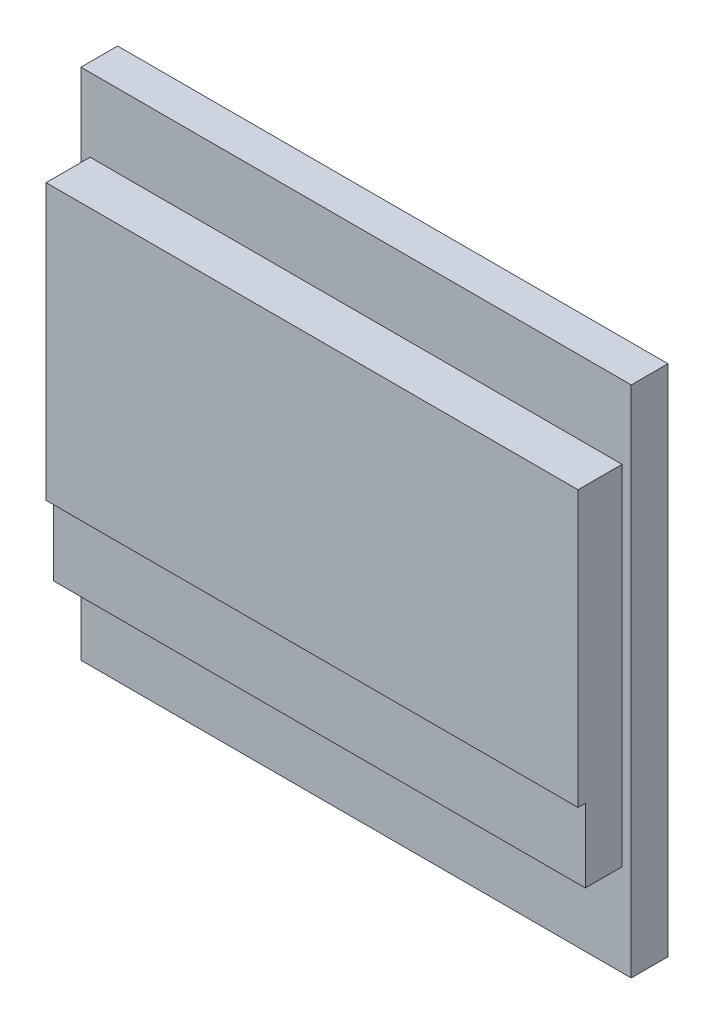
ISO-10303-21;
HEADER;
FILE_DESCRIPTION(('STEP AP214'),'2;1');
FILE_NAME('part.step','',(''),(''),'','','');
FILE_SCHEMA(('AUTOMOTIVE_DESIGN { 1 0 10303 214 1 1 1 1 }'));
ENDSEC;
DATA;
#1=APPLICATION_CONTEXT('core data for automotive mechanical design processes');
#2=APPLICATION_PROTOCOL_DEFINITION('international standard','automotive_design',2000,#1);
#3=PRODUCT_CONTEXT('',#1,'mechanical');
#4=PRODUCT('Part','Part','',(#3));
#5=PRODUCT_RELATED_PRODUCT_CATEGORY('part','',(#4));
#6=PRODUCT_DEFINITION_FORMATION('','',#4);
#7=PRODUCT_DEFINITION_CONTEXT('part definition',#1,'design');
#8=PRODUCT_DEFINITION('design','',#6,#7);
#9=PRODUCT_DEFINITION_SHAPE('','',#8);
#10=(LENGTH_UNIT() NAMED_UNIT(*) SI_UNIT(.MILLI.,.METRE.));
#11=(NAMED_UNIT(*) PLANE_ANGLE_UNIT() SI_UNIT($,.RADIAN.));
#12=(NAMED_UNIT(*) SI_UNIT($,.STERADIAN.) SOLID_ANGLE_UNIT());
#13=UNCERTAINTY_MEASURE_WITH_UNIT(LENGTH_MEASURE(1.E-05),#10,'distance_accuracy_value','');
#14=(GEOMETRIC_REPRESENTATION_CONTEXT(3) GLOBAL_UNCERTAINTY_ASSIGNED_CONTEXT((#13)) GLOBAL_UNIT_ASSIGNED_CONTEXT((#10,
#11,#12)) REPRESENTATION_CONTEXT('',''));
#15=CARTESIAN_POINT('',(0.,0.,0.));
#16=DIRECTION('',(0.,0.,1.));
#17=DIRECTION('',(1.,0.,0.));
#18=AXIS2_PLACEMENT_3D('',#15,#16,#17);
#19=CARTESIAN_POINT('',(0.,0.,2.));
#20=DIRECTION('',(0.,0.,1.));
#21=DIRECTION('',(1.,0.,0.));
#22=AXIS2_PLACEMENT_3D('',#19,#20,#21);
#23=PLANE('',#22);
#24=DIRECTION('',(0.,1.,0.));
#25=VECTOR('',#24,1.);
#26=CARTESIAN_POINT('',(14.5,-8.99999999999999,2.));
#27=LINE('',#26,#25);
#28=CARTESIAN_POINT('',(14.5,-8.99999999999999,2.));
#29=VERTEX_POINT('',#28);
#30=CARTESIAN_POINT('',(14.5,-4.99999999999999,2.));
#31=VERTEX_POINT('',#30);
#32=EDGE_CURVE('E157',#29,#31,#27,.T.);
#33=ORIENTED_EDGE('',*,*,#32,.T.);
#34=DIRECTION('',(-1.,0.,0.));
#35=VECTOR('',#34,1.);
#36=CARTESIAN_POINT('',(0.,-4.99999999999999,2.));
#37=LINE('',#36,#35);
#38=CARTESIAN_POINT('',(-14.5,-4.99999999999999,2.));
#39=VERTEX_POINT('',#38);
#40=EDGE_CURVE('E11',#31,#39,#37,.T.);
#41=ORIENTED_EDGE('',*,*,#40,.T.);
#42=DIRECTION('',(0.,-1.,0.));
#43=VECTOR('',#42,1.);
#44=CARTESIAN_POINT('',(-14.5,10.,2.));
#45=LINE('',#44,#43);
#46=CARTESIAN_POINT('',(-14.5,-8.99999999999999,2.));
#47=VERTEX_POINT('',#46);
#48=EDGE_CURVE('E141',#39,#47,#45,.T.);
#49=ORIENTED_EDGE('',*,*,#48,.T.);
#50=DIRECTION('',(1.,0.,0.));
#51=VECTOR('',#50,1.);
#52=CARTESIAN_POINT('',(-14.5,-8.99999999999999,2.));
#53=LINE('',#52,#51);
#54=EDGE_CURVE('E153',#47,#29,#53,.T.);
#55=ORIENTED_EDGE('',*,*,#54,.T.);
#56=EDGE_LOOP('',(#33,#41,#49,#55));
#57=FACE_BOUND('',#56,.T.);
#58=ADVANCED_FACE('F39',(#57),#23,.T.);
#59=CARTESIAN_POINT('',(0.,0.,0.));
#60=DIRECTION('',(0.,0.,-1.));
#61=DIRECTION('',(-1.,0.,0.));
#62=AXIS2_PLACEMENT_3D('',#59,#60,#61);
#63=PLANE('',#62);
#64=DIRECTION('',(0.,1.,0.));
#65=VECTOR('',#64,1.);
#66=CARTESIAN_POINT('',(15.,-14.,0.));
#67=LINE('',#66,#65);
#68=CARTESIAN_POINT('',(15.,-14.,0.));
#69=VERTEX_POINT('',#68);
#70=CARTESIAN_POINT('',(15.,14.,0.));
#71=VERTEX_POINT('',#70);
#72=EDGE_CURVE('E182',#69,#71,#67,.T.);
#73=ORIENTED_EDGE('',*,*,#72,.T.);
#74=DIRECTION('',(-1.,0.,0.));
#75=VECTOR('',#74,1.);
#76=CARTESIAN_POINT('',(-15.,14.,0.));
#77=LINE('',#76,#75);
#78=CARTESIAN_POINT('',(-15.,14.,0.));
#79=VERTEX_POINT('',#78);
#80=EDGE_CURVE('E204',#71,#79,#77,.T.);
#81=ORIENTED_EDGE('',*,*,#80,.T.);
#82=DIRECTION('',(0.,-1.,0.));
#83=VECTOR('',#82,1.);
#84=CARTESIAN_POINT('',(-15.,-14.,0.));
#85=LINE('',#84,#83);
#86=CARTESIAN_POINT('',(-15.,-14.,0.));
#87=VERTEX_POINT('',#86);
#88=EDGE_CURVE('E208',#79,#87,#85,.T.);
#89=ORIENTED_EDGE('',*,*,#88,.T.);
#90=DIRECTION('',(1.,0.,0.));
#91=VECTOR('',#90,1.);
#92=CARTESIAN_POINT('',(-15.,-14.,0.));
#93=LINE('',#92,#91);
#94=EDGE_CURVE('E188',#87,#69,#93,.T.);
#95=ORIENTED_EDGE('',*,*,#94,.T.);
#96=EDGE_LOOP('',(#73,#81,#89,#95));
#97=FACE_BOUND('',#96,.T.);
#98=DIRECTION('',(0.,-1.,0.));
#99=VECTOR('',#98,1.);
#100=CARTESIAN_POINT('',(-14.5,10.,0.));
#101=LINE('',#100,#99);
#102=CARTESIAN_POINT('',(-14.5,10.,0.));
#103=VERTEX_POINT('',#102);
#104=CARTESIAN_POINT('',(-14.5,-8.99999999999999,0.));
#105=VERTEX_POINT('',#104);
#106=EDGE_CURVE('E55',#103,#105,#101,.T.);
#107=ORIENTED_EDGE('',*,*,#106,.F.);
#108=DIRECTION('',(1.,0.,0.));
#109=VECTOR('',#108,1.);
#110=CARTESIAN_POINT('',(-14.5,10.,0.));
#111=LINE('',#110,#109);
#112=CARTESIAN_POINT('',(14.5,10.,0.));
#113=VERTEX_POINT('',#112);
#114=EDGE_CURVE('E154',#103,#113,#111,.T.);
#115=ORIENTED_EDGE('',*,*,#114,.T.);
#116=DIRECTION('',(0.,1.,0.));
#117=VECTOR('',#116,1.);
#118=CARTESIAN_POINT('',(14.5,-8.99999999999999,0.));
#119=LINE('',#118,#117);
#120=CARTESIAN_POINT('',(14.5,-8.99999999999999,0.));
#121=VERTEX_POINT('',#120);
#122=EDGE_CURVE('E63',#121,#113,#119,.T.);
#123=ORIENTED_EDGE('',*,*,#122,.F.);
#124=DIRECTION('',(1.,0.,0.));
#125=VECTOR('',#124,1.);
#126=CARTESIAN_POINT('',(-14.5,-8.99999999999999,0.));
#127=LINE('',#126,#125);
#128=EDGE_CURVE('E146',#105,#121,#127,.T.);
#129=ORIENTED_EDGE('',*,*,#128,.F.);
#130=EDGE_LOOP('',(#107,#115,#123,#129));
#131=FACE_BOUND('',#130,.T.);
#132=ADVANCED_FACE('F232',(#97,#131),#63,.F.);
#133=CARTESIAN_POINT('',(15.,-14.,-2.));
#134=DIRECTION('',(1.,0.,0.));
#135=DIRECTION('',(0.,0.,-1.));
#136=AXIS2_PLACEMENT_3D('',#133,#134,#135);
#137=PLANE('',#136);
#138=ORIENTED_EDGE('',*,*,#72,.F.);
#139=DIRECTION('',(0.,0.,1.));
#140=VECTOR('',#139,1.);
#141=CARTESIAN_POINT('',(15.,-14.,-2.));
#142=LINE('',#141,#140);
#143=CARTESIAN_POINT('',(15.,-14.,-2.));
#144=VERTEX_POINT('',#143);
#145=EDGE_CURVE('E48',#144,#69,#142,.T.);
#146=ORIENTED_EDGE('',*,*,#145,.F.);
#147=DIRECTION('',(0.,1.,0.));
#148=VECTOR('',#147,1.);
#149=CARTESIAN_POINT('',(15.,-14.,-2.));
#150=LINE('',#149,#148);
#151=CARTESIAN_POINT('',(15.,14.,-2.));
#152=VERTEX_POINT('',#151);
#153=EDGE_CURVE('E183',#144,#152,#150,.T.);
#154=ORIENTED_EDGE('',*,*,#153,.T.);
#155=DIRECTION('',(0.,0.,1.));
#156=VECTOR('',#155,1.);
#157=CARTESIAN_POINT('',(15.,14.,-2.));
#158=LINE('',#157,#156);
#159=EDGE_CURVE('E200',#152,#71,#158,.T.);
#160=ORIENTED_EDGE('',*,*,#159,.T.);
#161=EDGE_LOOP('',(#138,#146,#154,#160));
#162=FACE_BOUND('',#161,.T.);
#163=ADVANCED_FACE('F41',(#162),#137,.T.);
#164=CARTESIAN_POINT('',(-15.,-14.,-2.));
#165=DIRECTION('',(0.,-1.,0.));
#166=DIRECTION('',(0.,0.,-1.));
#167=AXIS2_PLACEMENT_3D('',#164,#165,#166);
#168=PLANE('',#167);
#169=ORIENTED_EDGE('',*,*,#94,.F.);
#170=DIRECTION('',(0.,0.,1.));
#171=VECTOR('',#170,1.);
#172=CARTESIAN_POINT('',(-15.,-14.,-2.));
#173=LINE('',#172,#171);
#174=CARTESIAN_POINT('',(-15.,-14.,-2.));
#175=VERTEX_POINT('',#174);
#176=EDGE_CURVE('E217',#175,#87,#173,.T.);
#177=ORIENTED_EDGE('',*,*,#176,.F.);
#178=DIRECTION('',(1.,0.,0.));
#179=VECTOR('',#178,1.);
#180=CARTESIAN_POINT('',(-15.,-14.,-2.));
#181=LINE('',#180,#179);
#182=EDGE_CURVE('E196',#175,#144,#181,.T.);
#183=ORIENTED_EDGE('',*,*,#182,.T.);
#184=ORIENTED_EDGE('',*,*,#145,.T.);
#185=EDGE_LOOP('',(#169,#177,#183,#184));
#186=FACE_BOUND('',#185,.T.);
#187=ADVANCED_FACE('F235',(#186),#168,.T.);
#188=CARTESIAN_POINT('',(-15.,-14.,-2.));
#189=DIRECTION('',(-1.,0.,0.));
#190=DIRECTION('',(0.,0.,1.));
#191=AXIS2_PLACEMENT_3D('',#188,#189,#190);
#192=PLANE('',#191);
#193=ORIENTED_EDGE('',*,*,#88,.F.);
#194=DIRECTION('',(0.,0.,1.));
#195=VECTOR('',#194,1.);
#196=CARTESIAN_POINT('',(-15.,14.,-2.));
#197=LINE('',#196,#195);
#198=CARTESIAN_POINT('',(-15.,14.,-2.));
#199=VERTEX_POINT('',#198);
#200=EDGE_CURVE('E220',#199,#79,#197,.T.);
#201=ORIENTED_EDGE('',*,*,#200,.F.);
#202=DIRECTION('',(0.,-1.,0.));
#203=VECTOR('',#202,1.);
#204=CARTESIAN_POINT('',(-15.,-14.,-2.));
#205=LINE('',#204,#203);
#206=EDGE_CURVE('E192',#199,#175,#205,.T.);
#207=ORIENTED_EDGE('',*,*,#206,.T.);
#208=ORIENTED_EDGE('',*,*,#176,.T.);
#209=EDGE_LOOP('',(#193,#201,#207,#208));
#210=FACE_BOUND('',#209,.T.);
#211=ADVANCED_FACE('F241',(#210),#192,.T.);
#212=CARTESIAN_POINT('',(-15.,14.,-2.));
#213=DIRECTION('',(0.,1.,0.));
#214=DIRECTION('',(0.,0.,1.));
#215=AXIS2_PLACEMENT_3D('',#212,#213,#214);
#216=PLANE('',#215);
#217=ORIENTED_EDGE('',*,*,#80,.F.);
#218=ORIENTED_EDGE('',*,*,#159,.F.);
#219=DIRECTION('',(-1.,0.,0.));
#220=VECTOR('',#219,1.);
#221=CARTESIAN_POINT('',(-15.,14.,-2.));
#222=LINE('',#221,#220);
#223=EDGE_CURVE('E187',#152,#199,#222,.T.);
#224=ORIENTED_EDGE('',*,*,#223,.T.);
#225=ORIENTED_EDGE('',*,*,#200,.T.);
#226=EDGE_LOOP('',(#217,#218,#224,#225));
#227=FACE_BOUND('',#226,.T.);
#228=ADVANCED_FACE('F229',(#227),#216,.T.);
#229=CARTESIAN_POINT('',(0.,0.,-2.));
#230=DIRECTION('',(0.,0.,-1.));
#231=DIRECTION('',(-1.,0.,0.));
#232=AXIS2_PLACEMENT_3D('',#229,#230,#231);
#233=PLANE('',#232);
#234=ORIENTED_EDGE('',*,*,#153,.F.);
#235=ORIENTED_EDGE('',*,*,#182,.F.);
#236=ORIENTED_EDGE('',*,*,#206,.F.);
#237=ORIENTED_EDGE('',*,*,#223,.F.);
#238=EDGE_LOOP('',(#234,#235,#236,#237));
#239=FACE_BOUND('',#238,.T.);
#240=ADVANCED_FACE('F238',(#239),#233,.T.);
#241=CARTESIAN_POINT('',(-14.5,10.,2.));
#242=DIRECTION('',(1.,0.,0.));
#243=DIRECTION('',(0.,0.,-1.));
#244=AXIS2_PLACEMENT_3D('',#241,#242,#243);
#245=PLANE('',#244);
#246=ORIENTED_EDGE('',*,*,#106,.T.);
#247=DIRECTION('',(0.,0.,-1.));
#248=VECTOR('',#247,1.);
#249=CARTESIAN_POINT('',(-14.5,-8.99999999999999,2.));
#250=LINE('',#249,#248);
#251=EDGE_CURVE('E178',#47,#105,#250,.T.);
#252=ORIENTED_EDGE('',*,*,#251,.F.);
#253=ORIENTED_EDGE('',*,*,#48,.F.);
#254=DIRECTION('',(0.,0.,-1.));
#255=VECTOR('',#254,1.);
#256=CARTESIAN_POINT('',(-14.5,-4.99999999999999,2.4));
#257=LINE('',#256,#255);
#258=CARTESIAN_POINT('',(-14.5,-4.99999999999999,2.4));
#259=VERTEX_POINT('',#258);
#260=EDGE_CURVE('E120',#259,#39,#257,.T.);
#261=ORIENTED_EDGE('',*,*,#260,.F.);
#262=DIRECTION('',(0.,-1.,0.));
#263=VECTOR('',#262,1.);
#264=CARTESIAN_POINT('',(-14.5,10.,2.4));
#265=LINE('',#264,#263);
#266=CARTESIAN_POINT('',(-14.5,10.,2.4));
#267=VERTEX_POINT('',#266);
#268=EDGE_CURVE('E128',#267,#259,#265,.T.);
#269=ORIENTED_EDGE('',*,*,#268,.F.);
#270=DIRECTION('',(0.,0.,-1.));
#271=VECTOR('',#270,1.);
#272=CARTESIAN_POINT('',(-14.5,10.,2.));
#273=LINE('',#272,#271);
#274=EDGE_CURVE('E160',#267,#103,#273,.T.);
#275=ORIENTED_EDGE('',*,*,#274,.T.);
#276=EDGE_LOOP('',(#246,#252,#253,#261,#269,#275));
#277=FACE_BOUND('',#276,.T.);
#278=ADVANCED_FACE('F139',(#277),#245,.F.);
#279=CARTESIAN_POINT('',(-14.5,-8.99999999999999,2.));
#280=DIRECTION('',(0.,1.,0.));
#281=DIRECTION('',(0.,0.,1.));
#282=AXIS2_PLACEMENT_3D('',#279,#280,#281);
#283=PLANE('',#282);
#284=ORIENTED_EDGE('',*,*,#128,.T.);
#285=DIRECTION('',(0.,0.,-1.));
#286=VECTOR('',#285,1.);
#287=CARTESIAN_POINT('',(14.5,-8.99999999999999,2.));
#288=LINE('',#287,#286);
#289=EDGE_CURVE('E175',#29,#121,#288,.T.);
#290=ORIENTED_EDGE('',*,*,#289,.F.);
#291=ORIENTED_EDGE('',*,*,#54,.F.);
#292=ORIENTED_EDGE('',*,*,#251,.T.);
#293=EDGE_LOOP('',(#284,#290,#291,#292));
#294=FACE_BOUND('',#293,.T.);
#295=ADVANCED_FACE('F266',(#294),#283,.F.);
#296=CARTESIAN_POINT('',(14.5,-8.99999999999999,2.));
#297=DIRECTION('',(-1.,0.,0.));
#298=DIRECTION('',(0.,0.,1.));
#299=AXIS2_PLACEMENT_3D('',#296,#297,#298);
#300=PLANE('',#299);
#301=DIRECTION('',(0.,0.,-1.));
#302=VECTOR('',#301,1.);
#303=CARTESIAN_POINT('',(14.5,10.,2.));
#304=LINE('',#303,#302);
#305=CARTESIAN_POINT('',(14.5,10.,2.4));
#306=VERTEX_POINT('',#305);
#307=EDGE_CURVE('E171',#306,#113,#304,.T.);
#308=ORIENTED_EDGE('',*,*,#307,.F.);
#309=DIRECTION('',(0.,1.,0.));
#310=VECTOR('',#309,1.);
#311=CARTESIAN_POINT('',(14.5,10.,2.4));
#312=LINE('',#311,#310);
#313=CARTESIAN_POINT('',(14.5,-4.99999999999999,2.4));
#314=VERTEX_POINT('',#313);
#315=EDGE_CURVE('E127',#314,#306,#312,.T.);
#316=ORIENTED_EDGE('',*,*,#315,.F.);
#317=DIRECTION('',(0.,0.,-1.));
#318=VECTOR('',#317,1.);
#319=CARTESIAN_POINT('',(14.5,-4.99999999999999,2.4));
#320=LINE('',#319,#318);
#321=EDGE_CURVE('E122',#314,#31,#320,.T.);
#322=ORIENTED_EDGE('',*,*,#321,.T.);
#323=ORIENTED_EDGE('',*,*,#32,.F.);
#324=ORIENTED_EDGE('',*,*,#289,.T.);
#325=ORIENTED_EDGE('',*,*,#122,.T.);
#326=EDGE_LOOP('',(#308,#316,#322,#323,#324,#325));
#327=FACE_BOUND('',#326,.T.);
#328=ADVANCED_FACE('F262',(#327),#300,.F.);
#329=CARTESIAN_POINT('',(-14.5,10.,2.));
#330=DIRECTION('',(0.,1.,0.));
#331=DIRECTION('',(0.,0.,1.));
#332=AXIS2_PLACEMENT_3D('',#329,#330,#331);
#333=PLANE('',#332);
#334=ORIENTED_EDGE('',*,*,#114,.F.);
#335=ORIENTED_EDGE('',*,*,#274,.F.);
#336=DIRECTION('',(-1.,0.,0.));
#337=VECTOR('',#336,1.);
#338=CARTESIAN_POINT('',(-14.5,10.,2.4));
#339=LINE('',#338,#337);
#340=EDGE_CURVE('E134',#306,#267,#339,.T.);
#341=ORIENTED_EDGE('',*,*,#340,.F.);
#342=ORIENTED_EDGE('',*,*,#307,.T.);
#343=EDGE_LOOP('',(#334,#335,#341,#342));
#344=FACE_BOUND('',#343,.T.);
#345=ADVANCED_FACE('F259',(#344),#333,.T.);
#346=CARTESIAN_POINT('',(-14.5,-4.99999999999999,2.4));
#347=DIRECTION('',(0.,1.,0.));
#348=DIRECTION('',(0.,0.,1.));
#349=AXIS2_PLACEMENT_3D('',#346,#347,#348);
#350=PLANE('',#349);
#351=ORIENTED_EDGE('',*,*,#40,.F.);
#352=ORIENTED_EDGE('',*,*,#321,.F.);
#353=DIRECTION('',(1.,0.,0.));
#354=VECTOR('',#353,1.);
#355=CARTESIAN_POINT('',(-14.5,-4.99999999999999,2.4));
#356=LINE('',#355,#354);
#357=EDGE_CURVE('E116',#259,#314,#356,.T.);
#358=ORIENTED_EDGE('',*,*,#357,.F.);
#359=ORIENTED_EDGE('',*,*,#260,.T.);
#360=EDGE_LOOP('',(#351,#352,#358,#359));
#361=FACE_BOUND('',#360,.T.);
#362=ADVANCED_FACE('F118',(#361),#350,.F.);
#363=CARTESIAN_POINT('',(0.,0.,2.4));
#364=DIRECTION('',(0.,0.,1.));
#365=DIRECTION('',(1.,0.,0.));
#366=AXIS2_PLACEMENT_3D('',#363,#364,#365);
#367=PLANE('',#366);
#368=ORIENTED_EDGE('',*,*,#268,.T.);
#369=ORIENTED_EDGE('',*,*,#357,.T.);
#370=ORIENTED_EDGE('',*,*,#315,.T.);
#371=ORIENTED_EDGE('',*,*,#340,.T.);
#372=EDGE_LOOP('',(#368,#369,#370,#371));
#373=FACE_BOUND('',#372,.T.);
#374=ADVANCED_FACE('F132',(#373),#367,.T.);
#375=CLOSED_SHELL('',(#58,#132,#163,#187,#211,#228,#240,#278,#295,#328,#345,#362,#374));
#376=MANIFOLD_SOLID_BREP('B2',#375);
#377=ADVANCED_BREP_SHAPE_REPRESENTATION('',(#18,#376),#14);
#378=SHAPE_DEFINITION_REPRESENTATION(#9,#377);
ENDSEC;
END-ISO-10303-21;
